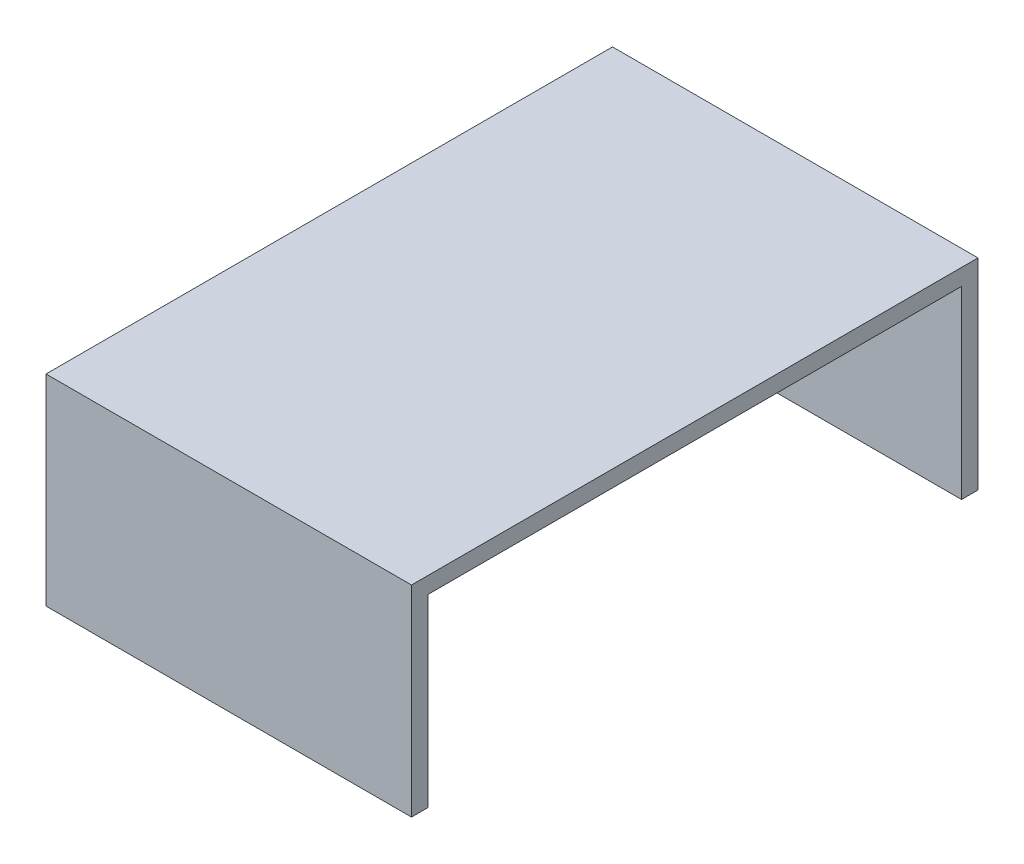
ISO-10303-21;
HEADER;
FILE_DESCRIPTION(('STEP AP214'),'2;1');
FILE_NAME('part.step','',(''),(''),'','','');
FILE_SCHEMA(('AUTOMOTIVE_DESIGN { 1 0 10303 214 1 1 1 1 }'));
ENDSEC;
DATA;
#1=APPLICATION_CONTEXT('core data for automotive mechanical design processes');
#2=APPLICATION_PROTOCOL_DEFINITION('international standard','automotive_design',2000,#1);
#3=PRODUCT_CONTEXT('',#1,'mechanical');
#4=PRODUCT('Part','Part','',(#3));
#5=PRODUCT_RELATED_PRODUCT_CATEGORY('part','',(#4));
#6=PRODUCT_DEFINITION_FORMATION('','',#4);
#7=PRODUCT_DEFINITION_CONTEXT('part definition',#1,'design');
#8=PRODUCT_DEFINITION('design','',#6,#7);
#9=PRODUCT_DEFINITION_SHAPE('','',#8);
#10=(LENGTH_UNIT() NAMED_UNIT(*) SI_UNIT(.MILLI.,.METRE.));
#11=(NAMED_UNIT(*) PLANE_ANGLE_UNIT() SI_UNIT($,.RADIAN.));
#12=(NAMED_UNIT(*) SI_UNIT($,.STERADIAN.) SOLID_ANGLE_UNIT());
#13=UNCERTAINTY_MEASURE_WITH_UNIT(LENGTH_MEASURE(1.E-05),#10,'distance_accuracy_value','');
#14=(GEOMETRIC_REPRESENTATION_CONTEXT(3) GLOBAL_UNCERTAINTY_ASSIGNED_CONTEXT((#13)) GLOBAL_UNIT_ASSIGNED_CONTEXT((#10,
#11,#12)) REPRESENTATION_CONTEXT('',''));
#15=CARTESIAN_POINT('',(0.,0.,0.));
#16=DIRECTION('',(0.,0.,1.));
#17=DIRECTION('',(1.,0.,0.));
#18=AXIS2_PLACEMENT_3D('',#15,#16,#17);
#19=CARTESIAN_POINT('',(0.,-5.5,-7.75));
#20=DIRECTION('',(0.,0.,-1.));
#21=DIRECTION('',(-1.,0.,0.));
#22=AXIS2_PLACEMENT_3D('',#19,#20,#21);
#23=PLANE('',#22);
#24=DIRECTION('',(0.,1.,0.));
#25=VECTOR('',#24,1.);
#26=CARTESIAN_POINT('',(10.,-5.5,-7.75));
#27=LINE('',#26,#25);
#28=CARTESIAN_POINT('',(10.,-5.5,-7.75));
#29=VERTEX_POINT('',#28);
#30=CARTESIAN_POINT('',(10.,0.,-7.75));
#31=VERTEX_POINT('',#30);
#32=EDGE_CURVE('E130',#29,#31,#27,.T.);
#33=ORIENTED_EDGE('',*,*,#32,.F.);
#34=DIRECTION('',(1.,0.,0.));
#35=VECTOR('',#34,1.);
#36=CARTESIAN_POINT('',(0.,-5.5,-7.75));
#37=LINE('',#36,#35);
#38=CARTESIAN_POINT('',(0.,-5.5,-7.75));
#39=VERTEX_POINT('',#38);
#40=EDGE_CURVE('E11',#39,#29,#37,.T.);
#41=ORIENTED_EDGE('',*,*,#40,.F.);
#42=DIRECTION('',(0.,1.,0.));
#43=VECTOR('',#42,1.);
#44=CARTESIAN_POINT('',(0.,-5.5,-7.75));
#45=LINE('',#44,#43);
#46=CARTESIAN_POINT('',(0.,0.,-7.75));
#47=VERTEX_POINT('',#46);
#48=EDGE_CURVE('E150',#39,#47,#45,.T.);
#49=ORIENTED_EDGE('',*,*,#48,.T.);
#50=DIRECTION('',(1.,0.,0.));
#51=VECTOR('',#50,1.);
#52=CARTESIAN_POINT('',(0.,0.,-7.75));
#53=LINE('',#52,#51);
#54=EDGE_CURVE('E36',#47,#31,#53,.T.);
#55=ORIENTED_EDGE('',*,*,#54,.T.);
#56=EDGE_LOOP('',(#33,#41,#49,#55));
#57=FACE_BOUND('',#56,.T.);
#58=ADVANCED_FACE('F33',(#57),#23,.T.);
#59=CARTESIAN_POINT('',(0.,-5.5,-7.3));
#60=DIRECTION('',(0.,-1.,0.));
#61=DIRECTION('',(0.,0.,-1.));
#62=AXIS2_PLACEMENT_3D('',#59,#60,#61);
#63=PLANE('',#62);
#64=DIRECTION('',(0.,0.,-1.));
#65=VECTOR('',#64,1.);
#66=CARTESIAN_POINT('',(10.,-5.5,-7.3));
#67=LINE('',#66,#65);
#68=CARTESIAN_POINT('',(10.,-5.5,-7.3));
#69=VERTEX_POINT('',#68);
#70=EDGE_CURVE('E148',#69,#29,#67,.T.);
#71=ORIENTED_EDGE('',*,*,#70,.F.);
#72=DIRECTION('',(1.,0.,0.));
#73=VECTOR('',#72,1.);
#74=CARTESIAN_POINT('',(0.,-5.5,-7.3));
#75=LINE('',#74,#73);
#76=CARTESIAN_POINT('',(0.,-5.5,-7.3));
#77=VERTEX_POINT('',#76);
#78=EDGE_CURVE('E42',#77,#69,#75,.T.);
#79=ORIENTED_EDGE('',*,*,#78,.F.);
#80=DIRECTION('',(0.,0.,-1.));
#81=VECTOR('',#80,1.);
#82=CARTESIAN_POINT('',(0.,-5.5,-7.3));
#83=LINE('',#82,#81);
#84=EDGE_CURVE('E120',#77,#39,#83,.T.);
#85=ORIENTED_EDGE('',*,*,#84,.T.);
#86=ORIENTED_EDGE('',*,*,#40,.T.);
#87=EDGE_LOOP('',(#71,#79,#85,#86));
#88=FACE_BOUND('',#87,.T.);
#89=ADVANCED_FACE('F162',(#88),#63,.T.);
#90=CARTESIAN_POINT('',(0.,-0.45,-7.3));
#91=DIRECTION('',(0.,0.,1.));
#92=DIRECTION('',(1.,0.,0.));
#93=AXIS2_PLACEMENT_3D('',#90,#91,#92);
#94=PLANE('',#93);
#95=DIRECTION('',(0.,-1.,0.));
#96=VECTOR('',#95,1.);
#97=CARTESIAN_POINT('',(10.,-0.45,-7.3));
#98=LINE('',#97,#96);
#99=CARTESIAN_POINT('',(10.,-0.45,-7.3));
#100=VERTEX_POINT('',#99);
#101=EDGE_CURVE('E107',#100,#69,#98,.T.);
#102=ORIENTED_EDGE('',*,*,#101,.F.);
#103=DIRECTION('',(1.,0.,0.));
#104=VECTOR('',#103,1.);
#105=CARTESIAN_POINT('',(0.,-0.45,-7.3));
#106=LINE('',#105,#104);
#107=CARTESIAN_POINT('',(0.,-0.45,-7.3));
#108=VERTEX_POINT('',#107);
#109=EDGE_CURVE('E102',#108,#100,#106,.T.);
#110=ORIENTED_EDGE('',*,*,#109,.F.);
#111=DIRECTION('',(0.,-1.,0.));
#112=VECTOR('',#111,1.);
#113=CARTESIAN_POINT('',(0.,-0.45,-7.3));
#114=LINE('',#113,#112);
#115=EDGE_CURVE('E105',#108,#77,#114,.T.);
#116=ORIENTED_EDGE('',*,*,#115,.T.);
#117=ORIENTED_EDGE('',*,*,#78,.T.);
#118=EDGE_LOOP('',(#102,#110,#116,#117));
#119=FACE_BOUND('',#118,.T.);
#120=ADVANCED_FACE('F104',(#119),#94,.T.);
#121=CARTESIAN_POINT('',(0.,-0.45,7.3));
#122=DIRECTION('',(0.,-1.,0.));
#123=DIRECTION('',(0.,0.,-1.));
#124=AXIS2_PLACEMENT_3D('',#121,#122,#123);
#125=PLANE('',#124);
#126=DIRECTION('',(0.,0.,-1.));
#127=VECTOR('',#126,1.);
#128=CARTESIAN_POINT('',(10.,-0.45,7.3));
#129=LINE('',#128,#127);
#130=CARTESIAN_POINT('',(10.,-0.45,7.3));
#131=VERTEX_POINT('',#130);
#132=EDGE_CURVE('E145',#131,#100,#129,.T.);
#133=ORIENTED_EDGE('',*,*,#132,.F.);
#134=DIRECTION('',(1.,0.,0.));
#135=VECTOR('',#134,1.);
#136=CARTESIAN_POINT('',(0.,-0.45,7.3));
#137=LINE('',#136,#135);
#138=CARTESIAN_POINT('',(0.,-0.45,7.3));
#139=VERTEX_POINT('',#138);
#140=EDGE_CURVE('E112',#139,#131,#137,.T.);
#141=ORIENTED_EDGE('',*,*,#140,.F.);
#142=DIRECTION('',(0.,0.,-1.));
#143=VECTOR('',#142,1.);
#144=CARTESIAN_POINT('',(0.,-0.45,7.3));
#145=LINE('',#144,#143);
#146=EDGE_CURVE('E118',#139,#108,#145,.T.);
#147=ORIENTED_EDGE('',*,*,#146,.T.);
#148=ORIENTED_EDGE('',*,*,#109,.T.);
#149=EDGE_LOOP('',(#133,#141,#147,#148));
#150=FACE_BOUND('',#149,.T.);
#151=ADVANCED_FACE('F122',(#150),#125,.T.);
#152=CARTESIAN_POINT('',(0.,-5.5,7.3));
#153=DIRECTION('',(0.,0.,-1.));
#154=DIRECTION('',(-1.,0.,0.));
#155=AXIS2_PLACEMENT_3D('',#152,#153,#154);
#156=PLANE('',#155);
#157=DIRECTION('',(0.,1.,0.));
#158=VECTOR('',#157,1.);
#159=CARTESIAN_POINT('',(10.,-5.5,7.3));
#160=LINE('',#159,#158);
#161=CARTESIAN_POINT('',(10.,-5.5,7.3));
#162=VERTEX_POINT('',#161);
#163=EDGE_CURVE('E142',#162,#131,#160,.T.);
#164=ORIENTED_EDGE('',*,*,#163,.F.);
#165=DIRECTION('',(1.,0.,0.));
#166=VECTOR('',#165,1.);
#167=CARTESIAN_POINT('',(0.,-5.5,7.3));
#168=LINE('',#167,#166);
#169=CARTESIAN_POINT('',(0.,-5.5,7.3));
#170=VERTEX_POINT('',#169);
#171=EDGE_CURVE('E154',#170,#162,#168,.T.);
#172=ORIENTED_EDGE('',*,*,#171,.F.);
#173=DIRECTION('',(0.,1.,0.));
#174=VECTOR('',#173,1.);
#175=CARTESIAN_POINT('',(0.,-5.5,7.3));
#176=LINE('',#175,#174);
#177=EDGE_CURVE('E123',#170,#139,#176,.T.);
#178=ORIENTED_EDGE('',*,*,#177,.T.);
#179=ORIENTED_EDGE('',*,*,#140,.T.);
#180=EDGE_LOOP('',(#164,#172,#178,#179));
#181=FACE_BOUND('',#180,.T.);
#182=ADVANCED_FACE('F175',(#181),#156,.T.);
#183=CARTESIAN_POINT('',(0.,-5.5,7.75));
#184=DIRECTION('',(0.,-1.,0.));
#185=DIRECTION('',(0.,0.,-1.));
#186=AXIS2_PLACEMENT_3D('',#183,#184,#185);
#187=PLANE('',#186);
#188=DIRECTION('',(0.,0.,-1.));
#189=VECTOR('',#188,1.);
#190=CARTESIAN_POINT('',(10.,-5.5,7.75));
#191=LINE('',#190,#189);
#192=CARTESIAN_POINT('',(10.,-5.5,7.75));
#193=VERTEX_POINT('',#192);
#194=EDGE_CURVE('E139',#193,#162,#191,.T.);
#195=ORIENTED_EDGE('',*,*,#194,.F.);
#196=DIRECTION('',(1.,0.,0.));
#197=VECTOR('',#196,1.);
#198=CARTESIAN_POINT('',(0.,-5.5,7.75));
#199=LINE('',#198,#197);
#200=CARTESIAN_POINT('',(0.,-5.5,7.75));
#201=VERTEX_POINT('',#200);
#202=EDGE_CURVE('E156',#201,#193,#199,.T.);
#203=ORIENTED_EDGE('',*,*,#202,.F.);
#204=DIRECTION('',(0.,0.,-1.));
#205=VECTOR('',#204,1.);
#206=CARTESIAN_POINT('',(0.,-5.5,7.75));
#207=LINE('',#206,#205);
#208=EDGE_CURVE('E125',#201,#170,#207,.T.);
#209=ORIENTED_EDGE('',*,*,#208,.T.);
#210=ORIENTED_EDGE('',*,*,#171,.T.);
#211=EDGE_LOOP('',(#195,#203,#209,#210));
#212=FACE_BOUND('',#211,.T.);
#213=ADVANCED_FACE('F178',(#212),#187,.T.);
#214=CARTESIAN_POINT('',(0.,0.,7.75));
#215=DIRECTION('',(0.,0.,1.));
#216=DIRECTION('',(1.,0.,0.));
#217=AXIS2_PLACEMENT_3D('',#214,#215,#216);
#218=PLANE('',#217);
#219=DIRECTION('',(0.,-1.,0.));
#220=VECTOR('',#219,1.);
#221=CARTESIAN_POINT('',(10.,0.,7.75));
#222=LINE('',#221,#220);
#223=CARTESIAN_POINT('',(10.,0.,7.75));
#224=VERTEX_POINT('',#223);
#225=EDGE_CURVE('E136',#224,#193,#222,.T.);
#226=ORIENTED_EDGE('',*,*,#225,.F.);
#227=DIRECTION('',(1.,0.,0.));
#228=VECTOR('',#227,1.);
#229=CARTESIAN_POINT('',(0.,0.,7.75));
#230=LINE('',#229,#228);
#231=CARTESIAN_POINT('',(0.,0.,7.75));
#232=VERTEX_POINT('',#231);
#233=EDGE_CURVE('E157',#232,#224,#230,.T.);
#234=ORIENTED_EDGE('',*,*,#233,.F.);
#235=DIRECTION('',(0.,-1.,0.));
#236=VECTOR('',#235,1.);
#237=CARTESIAN_POINT('',(0.,0.,7.75));
#238=LINE('',#237,#236);
#239=EDGE_CURVE('E253',#232,#201,#238,.T.);
#240=ORIENTED_EDGE('',*,*,#239,.T.);
#241=ORIENTED_EDGE('',*,*,#202,.T.);
#242=EDGE_LOOP('',(#226,#234,#240,#241));
#243=FACE_BOUND('',#242,.T.);
#244=ADVANCED_FACE('F182',(#243),#218,.T.);
#245=CARTESIAN_POINT('',(0.,0.,-7.75));
#246=DIRECTION('',(0.,1.,0.));
#247=DIRECTION('',(0.,0.,1.));
#248=AXIS2_PLACEMENT_3D('',#245,#246,#247);
#249=PLANE('',#248);
#250=DIRECTION('',(0.,0.,1.));
#251=VECTOR('',#250,1.);
#252=CARTESIAN_POINT('',(10.,0.,-7.75));
#253=LINE('',#252,#251);
#254=EDGE_CURVE('E133',#31,#224,#253,.T.);
#255=ORIENTED_EDGE('',*,*,#254,.F.);
#256=ORIENTED_EDGE('',*,*,#54,.F.);
#257=DIRECTION('',(0.,0.,1.));
#258=VECTOR('',#257,1.);
#259=CARTESIAN_POINT('',(0.,0.,-7.75));
#260=LINE('',#259,#258);
#261=EDGE_CURVE('E254',#47,#232,#260,.T.);
#262=ORIENTED_EDGE('',*,*,#261,.T.);
#263=ORIENTED_EDGE('',*,*,#233,.T.);
#264=EDGE_LOOP('',(#255,#256,#262,#263));
#265=FACE_BOUND('',#264,.T.);
#266=ADVANCED_FACE('F159',(#265),#249,.T.);
#267=CARTESIAN_POINT('',(0.,0.,0.));
#268=DIRECTION('',(1.,0.,0.));
#269=DIRECTION('',(0.,0.,-1.));
#270=AXIS2_PLACEMENT_3D('',#267,#268,#269);
#271=PLANE('',#270);
#272=ORIENTED_EDGE('',*,*,#48,.F.);
#273=ORIENTED_EDGE('',*,*,#84,.F.);
#274=ORIENTED_EDGE('',*,*,#115,.F.);
#275=ORIENTED_EDGE('',*,*,#146,.F.);
#276=ORIENTED_EDGE('',*,*,#177,.F.);
#277=ORIENTED_EDGE('',*,*,#208,.F.);
#278=ORIENTED_EDGE('',*,*,#239,.F.);
#279=ORIENTED_EDGE('',*,*,#261,.F.);
#280=EDGE_LOOP('',(#272,#273,#274,#275,#276,#277,#278,#279));
#281=FACE_BOUND('',#280,.T.);
#282=ADVANCED_FACE('F116',(#281),#271,.F.);
#283=CARTESIAN_POINT('',(10.,0.,0.));
#284=DIRECTION('',(1.,0.,0.));
#285=DIRECTION('',(0.,0.,-1.));
#286=AXIS2_PLACEMENT_3D('',#283,#284,#285);
#287=PLANE('',#286);
#288=ORIENTED_EDGE('',*,*,#32,.T.);
#289=ORIENTED_EDGE('',*,*,#254,.T.);
#290=ORIENTED_EDGE('',*,*,#225,.T.);
#291=ORIENTED_EDGE('',*,*,#194,.T.);
#292=ORIENTED_EDGE('',*,*,#163,.T.);
#293=ORIENTED_EDGE('',*,*,#132,.T.);
#294=ORIENTED_EDGE('',*,*,#101,.T.);
#295=ORIENTED_EDGE('',*,*,#70,.T.);
#296=EDGE_LOOP('',(#288,#289,#290,#291,#292,#293,#294,#295));
#297=FACE_BOUND('',#296,.T.);
#298=ADVANCED_FACE('F161',(#297),#287,.T.);
#299=CLOSED_SHELL('',(#58,#89,#120,#151,#182,#213,#244,#266,#282,#298));
#300=MANIFOLD_SOLID_BREP('B2',#299);
#301=ADVANCED_BREP_SHAPE_REPRESENTATION('',(#18,#300),#14);
#302=SHAPE_DEFINITION_REPRESENTATION(#9,#301);
ENDSEC;
END-ISO-10303-21;
